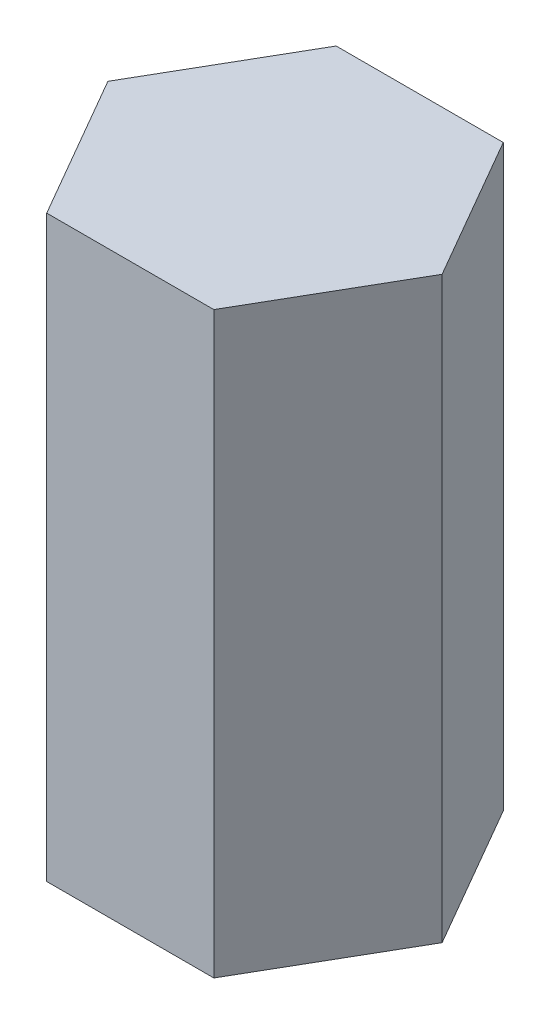
ISO-10303-21;
HEADER;
FILE_DESCRIPTION(('STEP AP214'),'2;1');
FILE_NAME('part.step','',(''),(''),'','','');
FILE_SCHEMA(('AUTOMOTIVE_DESIGN { 1 0 10303 214 1 1 1 1 }'));
ENDSEC;
DATA;
#1=APPLICATION_CONTEXT('core data for automotive mechanical design processes');
#2=APPLICATION_PROTOCOL_DEFINITION('international standard','automotive_design',2000,#1);
#3=PRODUCT_CONTEXT('',#1,'mechanical');
#4=PRODUCT('Part','Part','',(#3));
#5=PRODUCT_RELATED_PRODUCT_CATEGORY('part','',(#4));
#6=PRODUCT_DEFINITION_FORMATION('','',#4);
#7=PRODUCT_DEFINITION_CONTEXT('part definition',#1,'design');
#8=PRODUCT_DEFINITION('design','',#6,#7);
#9=PRODUCT_DEFINITION_SHAPE('','',#8);
#10=(LENGTH_UNIT() NAMED_UNIT(*) SI_UNIT(.MILLI.,.METRE.));
#11=(NAMED_UNIT(*) PLANE_ANGLE_UNIT() SI_UNIT($,.RADIAN.));
#12=(NAMED_UNIT(*) SI_UNIT($,.STERADIAN.) SOLID_ANGLE_UNIT());
#13=UNCERTAINTY_MEASURE_WITH_UNIT(LENGTH_MEASURE(1.E-05),#10,'distance_accuracy_value','');
#14=(GEOMETRIC_REPRESENTATION_CONTEXT(3) GLOBAL_UNCERTAINTY_ASSIGNED_CONTEXT((#13)) GLOBAL_UNIT_ASSIGNED_CONTEXT((#10,
#11,#12)) REPRESENTATION_CONTEXT('',''));
#15=CARTESIAN_POINT('',(0.,0.,0.));
#16=DIRECTION('',(0.,0.,1.));
#17=DIRECTION('',(1.,0.,0.));
#18=AXIS2_PLACEMENT_3D('',#15,#16,#17);
#19=CARTESIAN_POINT('',(7.21687836487037,50.,-12.5));
#20=DIRECTION('',(0.,0.,1.));
#21=DIRECTION('',(1.,0.,0.));
#22=AXIS2_PLACEMENT_3D('',#19,#20,#21);
#23=PLANE('',#22);
#24=DIRECTION('',(-1.,0.,0.));
#25=VECTOR('',#24,1.);
#26=CARTESIAN_POINT('',(7.21687836487037,0.,-12.5));
#27=LINE('',#26,#25);
#28=CARTESIAN_POINT('',(7.21687836487037,0.,-12.5));
#29=VERTEX_POINT('',#28);
#30=CARTESIAN_POINT('',(-7.21687836487031,0.,-12.5));
#31=VERTEX_POINT('',#30);
#32=EDGE_CURVE('E125',#29,#31,#27,.T.);
#33=ORIENTED_EDGE('',*,*,#32,.T.);
#34=DIRECTION('',(0.,-1.,0.));
#35=VECTOR('',#34,1.);
#36=CARTESIAN_POINT('',(-7.21687836487031,50.,-12.5));
#37=LINE('',#36,#35);
#38=CARTESIAN_POINT('',(-7.21687836487031,50.,-12.5));
#39=VERTEX_POINT('',#38);
#40=EDGE_CURVE('E11',#39,#31,#37,.T.);
#41=ORIENTED_EDGE('',*,*,#40,.F.);
#42=DIRECTION('',(-1.,0.,0.));
#43=VECTOR('',#42,1.);
#44=CARTESIAN_POINT('',(7.21687836487037,50.,-12.5));
#45=LINE('',#44,#43);
#46=CARTESIAN_POINT('',(7.21687836487037,50.,-12.5));
#47=VERTEX_POINT('',#46);
#48=EDGE_CURVE('E135',#47,#39,#45,.T.);
#49=ORIENTED_EDGE('',*,*,#48,.F.);
#50=DIRECTION('',(0.,-1.,0.));
#51=VECTOR('',#50,1.);
#52=CARTESIAN_POINT('',(7.21687836487037,50.,-12.5));
#53=LINE('',#52,#51);
#54=EDGE_CURVE('E121',#47,#29,#53,.T.);
#55=ORIENTED_EDGE('',*,*,#54,.T.);
#56=EDGE_LOOP('',(#33,#41,#49,#55));
#57=FACE_BOUND('',#56,.T.);
#58=ADVANCED_FACE('F41',(#57),#23,.F.);
#59=CARTESIAN_POINT('',(-7.21687836487031,50.,-12.5));
#60=DIRECTION('',(0.866025403784438,0.,0.5));
#61=DIRECTION('',(0.5,0.,-0.866025403784438));
#62=AXIS2_PLACEMENT_3D('',#59,#60,#61);
#63=PLANE('',#62);
#64=DIRECTION('',(-0.5,0.,0.866025403784438));
#65=VECTOR('',#64,1.);
#66=CARTESIAN_POINT('',(-7.21687836487031,0.,-12.5));
#67=LINE('',#66,#65);
#68=CARTESIAN_POINT('',(-14.4337567297406,0.,0.));
#69=VERTEX_POINT('',#68);
#70=EDGE_CURVE('E128',#31,#69,#67,.T.);
#71=ORIENTED_EDGE('',*,*,#70,.T.);
#72=DIRECTION('',(0.,-1.,0.));
#73=VECTOR('',#72,1.);
#74=CARTESIAN_POINT('',(-14.4337567297406,50.,0.));
#75=LINE('',#74,#73);
#76=CARTESIAN_POINT('',(-14.4337567297406,50.,0.));
#77=VERTEX_POINT('',#76);
#78=EDGE_CURVE('E49',#77,#69,#75,.T.);
#79=ORIENTED_EDGE('',*,*,#78,.F.);
#80=DIRECTION('',(-0.5,0.,0.866025403784438));
#81=VECTOR('',#80,1.);
#82=CARTESIAN_POINT('',(-7.21687836487031,50.,-12.5));
#83=LINE('',#82,#81);
#84=EDGE_CURVE('E94',#39,#77,#83,.T.);
#85=ORIENTED_EDGE('',*,*,#84,.F.);
#86=ORIENTED_EDGE('',*,*,#40,.T.);
#87=EDGE_LOOP('',(#71,#79,#85,#86));
#88=FACE_BOUND('',#87,.T.);
#89=ADVANCED_FACE('F159',(#88),#63,.F.);
#90=CARTESIAN_POINT('',(-14.4337567297406,50.,0.));
#91=DIRECTION('',(0.866025403784439,0.,-0.5));
#92=DIRECTION('',(-0.5,0.,-0.866025403784439));
#93=AXIS2_PLACEMENT_3D('',#90,#91,#92);
#94=PLANE('',#93);
#95=DIRECTION('',(0.5,0.,0.866025403784439));
#96=VECTOR('',#95,1.);
#97=CARTESIAN_POINT('',(-14.4337567297406,0.,0.));
#98=LINE('',#97,#96);
#99=CARTESIAN_POINT('',(-7.21687836487032,0.,12.5));
#100=VERTEX_POINT('',#99);
#101=EDGE_CURVE('E130',#69,#100,#98,.T.);
#102=ORIENTED_EDGE('',*,*,#101,.T.);
#103=DIRECTION('',(0.,-1.,0.));
#104=VECTOR('',#103,1.);
#105=CARTESIAN_POINT('',(-7.21687836487032,50.,12.5));
#106=LINE('',#105,#104);
#107=CARTESIAN_POINT('',(-7.21687836487032,50.,12.5));
#108=VERTEX_POINT('',#107);
#109=EDGE_CURVE('E116',#108,#100,#106,.T.);
#110=ORIENTED_EDGE('',*,*,#109,.F.);
#111=DIRECTION('',(0.5,0.,0.866025403784439));
#112=VECTOR('',#111,1.);
#113=CARTESIAN_POINT('',(-14.4337567297406,50.,0.));
#114=LINE('',#113,#112);
#115=EDGE_CURVE('E107',#77,#108,#114,.T.);
#116=ORIENTED_EDGE('',*,*,#115,.F.);
#117=ORIENTED_EDGE('',*,*,#78,.T.);
#118=EDGE_LOOP('',(#102,#110,#116,#117));
#119=FACE_BOUND('',#118,.T.);
#120=ADVANCED_FACE('F141',(#119),#94,.F.);
#121=CARTESIAN_POINT('',(-7.21687836487032,50.,12.5));
#122=DIRECTION('',(0.,0.,-1.));
#123=DIRECTION('',(-1.,0.,0.));
#124=AXIS2_PLACEMENT_3D('',#121,#122,#123);
#125=PLANE('',#124);
#126=DIRECTION('',(1.,0.,0.));
#127=VECTOR('',#126,1.);
#128=CARTESIAN_POINT('',(-7.21687836487032,0.,12.5));
#129=LINE('',#128,#127);
#130=CARTESIAN_POINT('',(7.21687836487037,0.,12.5));
#131=VERTEX_POINT('',#130);
#132=EDGE_CURVE('E115',#100,#131,#129,.T.);
#133=ORIENTED_EDGE('',*,*,#132,.T.);
#134=DIRECTION('',(0.,-1.,0.));
#135=VECTOR('',#134,1.);
#136=CARTESIAN_POINT('',(7.21687836487037,50.,12.5));
#137=LINE('',#136,#135);
#138=CARTESIAN_POINT('',(7.21687836487037,50.,12.5));
#139=VERTEX_POINT('',#138);
#140=EDGE_CURVE('E112',#139,#131,#137,.T.);
#141=ORIENTED_EDGE('',*,*,#140,.F.);
#142=DIRECTION('',(1.,0.,0.));
#143=VECTOR('',#142,1.);
#144=CARTESIAN_POINT('',(-7.21687836487032,50.,12.5));
#145=LINE('',#144,#143);
#146=EDGE_CURVE('E101',#108,#139,#145,.T.);
#147=ORIENTED_EDGE('',*,*,#146,.F.);
#148=ORIENTED_EDGE('',*,*,#109,.T.);
#149=EDGE_LOOP('',(#133,#141,#147,#148));
#150=FACE_BOUND('',#149,.T.);
#151=ADVANCED_FACE('F113',(#150),#125,.F.);
#152=CARTESIAN_POINT('',(7.21687836487037,50.,12.5));
#153=DIRECTION('',(-0.866025403784439,0.,-0.499999999999999));
#154=DIRECTION('',(-0.499999999999999,0.,0.866025403784439));
#155=AXIS2_PLACEMENT_3D('',#152,#153,#154);
#156=PLANE('',#155);
#157=DIRECTION('',(0.499999999999999,0.,-0.866025403784439));
#158=VECTOR('',#157,1.);
#159=CARTESIAN_POINT('',(7.21687836487037,0.,12.5));
#160=LINE('',#159,#158);
#161=CARTESIAN_POINT('',(14.4337567297407,0.,0.));
#162=VERTEX_POINT('',#161);
#163=EDGE_CURVE('E80',#131,#162,#160,.T.);
#164=ORIENTED_EDGE('',*,*,#163,.T.);
#165=DIRECTION('',(0.,-1.,0.));
#166=VECTOR('',#165,1.);
#167=CARTESIAN_POINT('',(14.4337567297407,50.,0.));
#168=LINE('',#167,#166);
#169=CARTESIAN_POINT('',(14.4337567297407,50.,0.));
#170=VERTEX_POINT('',#169);
#171=EDGE_CURVE('E117',#170,#162,#168,.T.);
#172=ORIENTED_EDGE('',*,*,#171,.F.);
#173=DIRECTION('',(0.499999999999999,0.,-0.866025403784439));
#174=VECTOR('',#173,1.);
#175=CARTESIAN_POINT('',(7.21687836487037,50.,12.5));
#176=LINE('',#175,#174);
#177=EDGE_CURVE('E105',#139,#170,#176,.T.);
#178=ORIENTED_EDGE('',*,*,#177,.F.);
#179=ORIENTED_EDGE('',*,*,#140,.T.);
#180=EDGE_LOOP('',(#164,#172,#178,#179));
#181=FACE_BOUND('',#180,.T.);
#182=ADVANCED_FACE('F119',(#181),#156,.F.);
#183=CARTESIAN_POINT('',(14.4337567297407,50.,0.));
#184=DIRECTION('',(-0.866025403784439,0.,0.499999999999999));
#185=DIRECTION('',(0.499999999999999,0.,0.866025403784439));
#186=AXIS2_PLACEMENT_3D('',#183,#184,#185);
#187=PLANE('',#186);
#188=DIRECTION('',(-0.499999999999999,0.,-0.866025403784439));
#189=VECTOR('',#188,1.);
#190=CARTESIAN_POINT('',(14.4337567297407,0.,0.));
#191=LINE('',#190,#189);
#192=EDGE_CURVE('E86',#162,#29,#191,.T.);
#193=ORIENTED_EDGE('',*,*,#192,.T.);
#194=ORIENTED_EDGE('',*,*,#54,.F.);
#195=DIRECTION('',(-0.499999999999999,0.,-0.866025403784439));
#196=VECTOR('',#195,1.);
#197=CARTESIAN_POINT('',(14.4337567297407,50.,0.));
#198=LINE('',#197,#196);
#199=EDGE_CURVE('E57',#170,#47,#198,.T.);
#200=ORIENTED_EDGE('',*,*,#199,.F.);
#201=ORIENTED_EDGE('',*,*,#171,.T.);
#202=EDGE_LOOP('',(#193,#194,#200,#201));
#203=FACE_BOUND('',#202,.T.);
#204=ADVANCED_FACE('F148',(#203),#187,.F.);
#205=CARTESIAN_POINT('',(0.,50.,0.));
#206=DIRECTION('',(0.,1.,0.));
#207=DIRECTION('',(0.,0.,1.));
#208=AXIS2_PLACEMENT_3D('',#205,#206,#207);
#209=PLANE('',#208);
#210=ORIENTED_EDGE('',*,*,#48,.T.);
#211=ORIENTED_EDGE('',*,*,#84,.T.);
#212=ORIENTED_EDGE('',*,*,#115,.T.);
#213=ORIENTED_EDGE('',*,*,#146,.T.);
#214=ORIENTED_EDGE('',*,*,#177,.T.);
#215=ORIENTED_EDGE('',*,*,#199,.T.);
#216=EDGE_LOOP('',(#210,#211,#212,#213,#214,#215));
#217=FACE_BOUND('',#216,.T.);
#218=ADVANCED_FACE('F103',(#217),#209,.T.);
#219=CARTESIAN_POINT('',(0.,0.,0.));
#220=DIRECTION('',(0.,1.,0.));
#221=DIRECTION('',(0.,0.,1.));
#222=AXIS2_PLACEMENT_3D('',#219,#220,#221);
#223=PLANE('',#222);
#224=ORIENTED_EDGE('',*,*,#32,.F.);
#225=ORIENTED_EDGE('',*,*,#192,.F.);
#226=ORIENTED_EDGE('',*,*,#163,.F.);
#227=ORIENTED_EDGE('',*,*,#132,.F.);
#228=ORIENTED_EDGE('',*,*,#101,.F.);
#229=ORIENTED_EDGE('',*,*,#70,.F.);
#230=EDGE_LOOP('',(#224,#225,#226,#227,#228,#229));
#231=FACE_BOUND('',#230,.T.);
#232=ADVANCED_FACE('F144',(#231),#223,.F.);
#233=CLOSED_SHELL('',(#58,#89,#120,#151,#182,#204,#218,#232));
#234=MANIFOLD_SOLID_BREP('B2',#233);
#235=ADVANCED_BREP_SHAPE_REPRESENTATION('',(#18,#234),#14);
#236=SHAPE_DEFINITION_REPRESENTATION(#9,#235);
ENDSEC;
END-ISO-10303-21;
